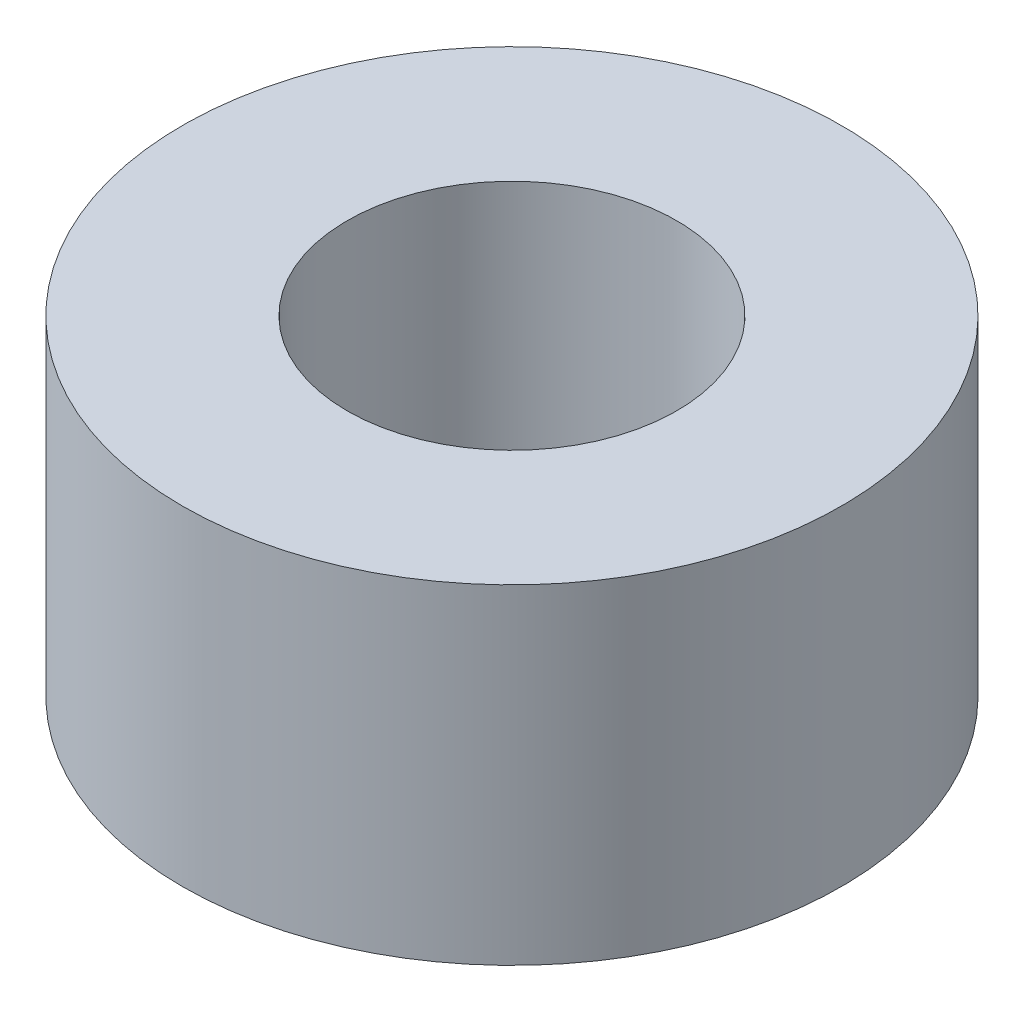
ISO-10303-21;
HEADER;
FILE_DESCRIPTION(('STEP AP214'),'2;1');
FILE_NAME('part.step','',(''),(''),'','','');
FILE_SCHEMA(('AUTOMOTIVE_DESIGN { 1 0 10303 214 1 1 1 1 }'));
ENDSEC;
DATA;
#1=APPLICATION_CONTEXT('core data for automotive mechanical design processes');
#2=APPLICATION_PROTOCOL_DEFINITION('international standard','automotive_design',2000,#1);
#3=PRODUCT_CONTEXT('',#1,'mechanical');
#4=PRODUCT('Part','Part','',(#3));
#5=PRODUCT_RELATED_PRODUCT_CATEGORY('part','',(#4));
#6=PRODUCT_DEFINITION_FORMATION('','',#4);
#7=PRODUCT_DEFINITION_CONTEXT('part definition',#1,'design');
#8=PRODUCT_DEFINITION('design','',#6,#7);
#9=PRODUCT_DEFINITION_SHAPE('','',#8);
#10=(LENGTH_UNIT() NAMED_UNIT(*) SI_UNIT(.MILLI.,.METRE.));
#11=(NAMED_UNIT(*) PLANE_ANGLE_UNIT() SI_UNIT($,.RADIAN.));
#12=(NAMED_UNIT(*) SI_UNIT($,.STERADIAN.) SOLID_ANGLE_UNIT());
#13=UNCERTAINTY_MEASURE_WITH_UNIT(LENGTH_MEASURE(1.E-05),#10,'distance_accuracy_value','');
#14=(GEOMETRIC_REPRESENTATION_CONTEXT(3) GLOBAL_UNCERTAINTY_ASSIGNED_CONTEXT((#13)) GLOBAL_UNIT_ASSIGNED_CONTEXT((#10,
#11,#12)) REPRESENTATION_CONTEXT('',''));
#15=CARTESIAN_POINT('',(0.,0.,0.));
#16=DIRECTION('',(0.,0.,1.));
#17=DIRECTION('',(1.,0.,0.));
#18=AXIS2_PLACEMENT_3D('',#15,#16,#17);
#19=CARTESIAN_POINT('',(0.,3.,0.));
#20=DIRECTION('',(0.,-1.,0.));
#21=DIRECTION('',(0.,0.,-1.));
#22=AXIS2_PLACEMENT_3D('',#19,#20,#21);
#23=CYLINDRICAL_SURFACE('',#22,3.);
#24=CARTESIAN_POINT('',(0.,3.,0.));
#25=DIRECTION('',(0.,1.,0.));
#26=DIRECTION('',(0.,0.,1.));
#27=AXIS2_PLACEMENT_3D('',#24,#25,#26);
#28=CIRCLE('',#27,3.);
#29=CARTESIAN_POINT('',(0.,3.,3.));
#30=VERTEX_POINT('',#29);
#31=EDGE_CURVE('E10',#30,#30,#28,.T.);
#32=ORIENTED_EDGE('',*,*,#31,.F.);
#33=EDGE_LOOP('',(#32));
#34=FACE_BOUND('',#33,.T.);
#35=CARTESIAN_POINT('',(0.,0.,0.));
#36=DIRECTION('',(0.,1.,0.));
#37=DIRECTION('',(0.,0.,1.));
#38=AXIS2_PLACEMENT_3D('',#35,#36,#37);
#39=CIRCLE('',#38,3.);
#40=CARTESIAN_POINT('',(0.,0.,3.));
#41=VERTEX_POINT('',#40);
#42=EDGE_CURVE('E38',#41,#41,#39,.T.);
#43=ORIENTED_EDGE('',*,*,#42,.T.);
#44=EDGE_LOOP('',(#43));
#45=FACE_BOUND('',#44,.T.);
#46=ADVANCED_FACE('F35',(#34,#45),#23,.T.);
#47=CARTESIAN_POINT('',(0.,3.,0.));
#48=DIRECTION('',(0.,1.,0.));
#49=DIRECTION('',(0.,0.,1.));
#50=AXIS2_PLACEMENT_3D('',#47,#48,#49);
#51=PLANE('',#50);
#52=CARTESIAN_POINT('',(0.,3.,0.));
#53=DIRECTION('',(0.,1.,0.));
#54=DIRECTION('',(0.,0.,1.));
#55=AXIS2_PLACEMENT_3D('',#52,#53,#54);
#56=CIRCLE('',#55,1.5);
#57=CARTESIAN_POINT('',(0.,3.,1.5));
#58=VERTEX_POINT('',#57);
#59=EDGE_CURVE('E47',#58,#58,#56,.T.);
#60=ORIENTED_EDGE('',*,*,#59,.F.);
#61=EDGE_LOOP('',(#60));
#62=FACE_BOUND('',#61,.T.);
#63=ORIENTED_EDGE('',*,*,#31,.T.);
#64=EDGE_LOOP('',(#63));
#65=FACE_BOUND('',#64,.T.);
#66=ADVANCED_FACE('F62',(#62,#65),#51,.T.);
#67=CARTESIAN_POINT('',(0.,0.,0.));
#68=DIRECTION('',(0.,1.,0.));
#69=DIRECTION('',(0.,0.,1.));
#70=AXIS2_PLACEMENT_3D('',#67,#68,#69);
#71=PLANE('',#70);
#72=CARTESIAN_POINT('',(0.,0.,0.));
#73=DIRECTION('',(0.,1.,0.));
#74=DIRECTION('',(0.,0.,1.));
#75=AXIS2_PLACEMENT_3D('',#72,#73,#74);
#76=CIRCLE('',#75,1.5);
#77=CARTESIAN_POINT('',(0.,0.,1.5));
#78=VERTEX_POINT('',#77);
#79=EDGE_CURVE('E45',#78,#78,#76,.T.);
#80=ORIENTED_EDGE('',*,*,#79,.T.);
#81=EDGE_LOOP('',(#80));
#82=FACE_BOUND('',#81,.T.);
#83=ORIENTED_EDGE('',*,*,#42,.F.);
#84=EDGE_LOOP('',(#83));
#85=FACE_BOUND('',#84,.T.);
#86=ADVANCED_FACE('F53',(#82,#85),#71,.F.);
#87=CARTESIAN_POINT('',(0.,0.,0.));
#88=DIRECTION('',(0.,1.,0.));
#89=DIRECTION('',(0.,0.,1.));
#90=AXIS2_PLACEMENT_3D('',#87,#88,#89);
#91=CYLINDRICAL_SURFACE('',#90,1.5);
#92=ORIENTED_EDGE('',*,*,#79,.F.);
#93=EDGE_LOOP('',(#92));
#94=FACE_BOUND('',#93,.T.);
#95=ORIENTED_EDGE('',*,*,#59,.T.);
#96=EDGE_LOOP('',(#95));
#97=FACE_BOUND('',#96,.T.);
#98=ADVANCED_FACE('F56',(#94,#97),#91,.F.);
#99=CLOSED_SHELL('',(#46,#66,#86,#98));
#100=MANIFOLD_SOLID_BREP('B2',#99);
#101=ADVANCED_BREP_SHAPE_REPRESENTATION('',(#18,#100),#14);
#102=SHAPE_DEFINITION_REPRESENTATION(#9,#101);
ENDSEC;
END-ISO-10303-21;
